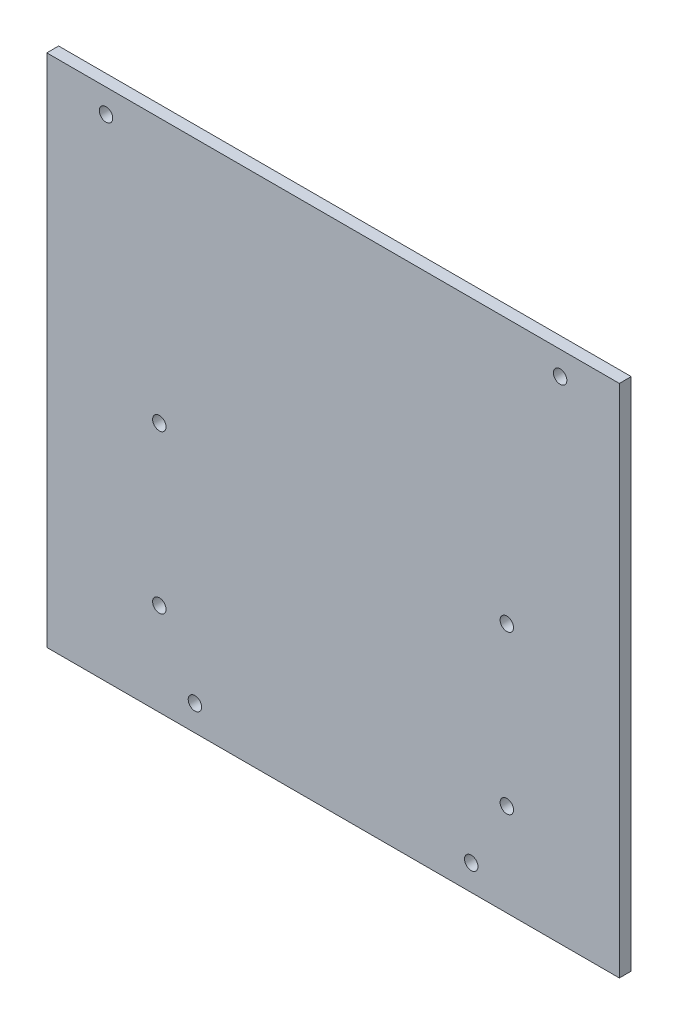
ISO-10303-21;
HEADER;
FILE_DESCRIPTION(('STEP AP214'),'2;1');
FILE_NAME('part.step','',(''),(''),'','','');
FILE_SCHEMA(('AUTOMOTIVE_DESIGN { 1 0 10303 214 1 1 1 1 }'));
ENDSEC;
DATA;
#1=APPLICATION_CONTEXT('core data for automotive mechanical design processes');
#2=APPLICATION_PROTOCOL_DEFINITION('international standard','automotive_design',2000,#1);
#3=PRODUCT_CONTEXT('',#1,'mechanical');
#4=PRODUCT('Part','Part','',(#3));
#5=PRODUCT_RELATED_PRODUCT_CATEGORY('part','',(#4));
#6=PRODUCT_DEFINITION_FORMATION('','',#4);
#7=PRODUCT_DEFINITION_CONTEXT('part definition',#1,'design');
#8=PRODUCT_DEFINITION('design','',#6,#7);
#9=PRODUCT_DEFINITION_SHAPE('','',#8);
#10=(LENGTH_UNIT() NAMED_UNIT(*) SI_UNIT(.MILLI.,.METRE.));
#11=(NAMED_UNIT(*) PLANE_ANGLE_UNIT() SI_UNIT($,.RADIAN.));
#12=(NAMED_UNIT(*) SI_UNIT($,.STERADIAN.) SOLID_ANGLE_UNIT());
#13=UNCERTAINTY_MEASURE_WITH_UNIT(LENGTH_MEASURE(1.E-05),#10,'distance_accuracy_value','');
#14=(GEOMETRIC_REPRESENTATION_CONTEXT(3) GLOBAL_UNCERTAINTY_ASSIGNED_CONTEXT((#13)) GLOBAL_UNIT_ASSIGNED_CONTEXT((#10,
#11,#12)) REPRESENTATION_CONTEXT('',''));
#15=CARTESIAN_POINT('',(0.,0.,0.));
#16=DIRECTION('',(0.,0.,1.));
#17=DIRECTION('',(1.,0.,0.));
#18=AXIS2_PLACEMENT_3D('',#15,#16,#17);
#19=CARTESIAN_POINT('',(-72.5,0.,3.));
#20=DIRECTION('',(1.,0.,0.));
#21=DIRECTION('',(0.,0.,-1.));
#22=AXIS2_PLACEMENT_3D('',#19,#20,#21);
#23=PLANE('',#22);
#24=DIRECTION('',(0.,-1.,0.));
#25=VECTOR('',#24,1.);
#26=CARTESIAN_POINT('',(-72.5,0.,0.));
#27=LINE('',#26,#25);
#28=CARTESIAN_POINT('',(-72.5,130.4,0.));
#29=VERTEX_POINT('',#28);
#30=CARTESIAN_POINT('',(-72.5,0.,0.));
#31=VERTEX_POINT('',#30);
#32=EDGE_CURVE('E103',#29,#31,#27,.T.);
#33=ORIENTED_EDGE('',*,*,#32,.T.);
#34=DIRECTION('',(0.,0.,-1.));
#35=VECTOR('',#34,1.);
#36=CARTESIAN_POINT('',(-72.5,0.,3.));
#37=LINE('',#36,#35);
#38=CARTESIAN_POINT('',(-72.5,0.,3.));
#39=VERTEX_POINT('',#38);
#40=EDGE_CURVE('E11',#39,#31,#37,.T.);
#41=ORIENTED_EDGE('',*,*,#40,.F.);
#42=DIRECTION('',(0.,-1.,0.));
#43=VECTOR('',#42,1.);
#44=CARTESIAN_POINT('',(-72.5,0.,3.));
#45=LINE('',#44,#43);
#46=CARTESIAN_POINT('',(-72.5,130.4,3.));
#47=VERTEX_POINT('',#46);
#48=EDGE_CURVE('E90',#47,#39,#45,.T.);
#49=ORIENTED_EDGE('',*,*,#48,.F.);
#50=DIRECTION('',(0.,0.,-1.));
#51=VECTOR('',#50,1.);
#52=CARTESIAN_POINT('',(-72.5,130.4,3.));
#53=LINE('',#52,#51);
#54=EDGE_CURVE('E99',#47,#29,#53,.T.);
#55=ORIENTED_EDGE('',*,*,#54,.T.);
#56=EDGE_LOOP('',(#33,#41,#49,#55));
#57=FACE_BOUND('',#56,.T.);
#58=ADVANCED_FACE('F37',(#57),#23,.F.);
#59=CARTESIAN_POINT('',(-72.5,0.,3.));
#60=DIRECTION('',(0.,1.,0.));
#61=DIRECTION('',(0.,0.,1.));
#62=AXIS2_PLACEMENT_3D('',#59,#60,#61);
#63=PLANE('',#62);
#64=DIRECTION('',(1.,0.,0.));
#65=VECTOR('',#64,1.);
#66=CARTESIAN_POINT('',(-72.5,0.,0.));
#67=LINE('',#66,#65);
#68=CARTESIAN_POINT('',(72.5,0.,0.));
#69=VERTEX_POINT('',#68);
#70=EDGE_CURVE('E94',#31,#69,#67,.T.);
#71=ORIENTED_EDGE('',*,*,#70,.T.);
#72=DIRECTION('',(0.,0.,-1.));
#73=VECTOR('',#72,1.);
#74=CARTESIAN_POINT('',(72.5,0.,3.));
#75=LINE('',#74,#73);
#76=CARTESIAN_POINT('',(72.5,0.,3.));
#77=VERTEX_POINT('',#76);
#78=EDGE_CURVE('E46',#77,#69,#75,.T.);
#79=ORIENTED_EDGE('',*,*,#78,.F.);
#80=DIRECTION('',(1.,0.,0.));
#81=VECTOR('',#80,1.);
#82=CARTESIAN_POINT('',(-72.5,0.,3.));
#83=LINE('',#82,#81);
#84=EDGE_CURVE('E85',#39,#77,#83,.T.);
#85=ORIENTED_EDGE('',*,*,#84,.F.);
#86=ORIENTED_EDGE('',*,*,#40,.T.);
#87=EDGE_LOOP('',(#71,#79,#85,#86));
#88=FACE_BOUND('',#87,.T.);
#89=ADVANCED_FACE('F93',(#88),#63,.F.);
#90=CARTESIAN_POINT('',(72.5,0.,3.));
#91=DIRECTION('',(-1.,0.,0.));
#92=DIRECTION('',(0.,0.,1.));
#93=AXIS2_PLACEMENT_3D('',#90,#91,#92);
#94=PLANE('',#93);
#95=DIRECTION('',(0.,1.,0.));
#96=VECTOR('',#95,1.);
#97=CARTESIAN_POINT('',(72.5,0.,0.));
#98=LINE('',#97,#96);
#99=CARTESIAN_POINT('',(72.5,130.4,0.));
#100=VERTEX_POINT('',#99);
#101=EDGE_CURVE('E72',#69,#100,#98,.T.);
#102=ORIENTED_EDGE('',*,*,#101,.T.);
#103=DIRECTION('',(0.,0.,-1.));
#104=VECTOR('',#103,1.);
#105=CARTESIAN_POINT('',(72.5,130.4,3.));
#106=LINE('',#105,#104);
#107=CARTESIAN_POINT('',(72.5,130.4,3.));
#108=VERTEX_POINT('',#107);
#109=EDGE_CURVE('E95',#108,#100,#106,.T.);
#110=ORIENTED_EDGE('',*,*,#109,.F.);
#111=DIRECTION('',(0.,1.,0.));
#112=VECTOR('',#111,1.);
#113=CARTESIAN_POINT('',(72.5,0.,3.));
#114=LINE('',#113,#112);
#115=EDGE_CURVE('E88',#77,#108,#114,.T.);
#116=ORIENTED_EDGE('',*,*,#115,.F.);
#117=ORIENTED_EDGE('',*,*,#78,.T.);
#118=EDGE_LOOP('',(#102,#110,#116,#117));
#119=FACE_BOUND('',#118,.T.);
#120=ADVANCED_FACE('F97',(#119),#94,.F.);
#121=CARTESIAN_POINT('',(-72.5,130.4,3.));
#122=DIRECTION('',(0.,-1.,0.));
#123=DIRECTION('',(0.,0.,-1.));
#124=AXIS2_PLACEMENT_3D('',#121,#122,#123);
#125=PLANE('',#124);
#126=DIRECTION('',(-1.,0.,0.));
#127=VECTOR('',#126,1.);
#128=CARTESIAN_POINT('',(-72.5,130.4,0.));
#129=LINE('',#128,#127);
#130=EDGE_CURVE('E78',#100,#29,#129,.T.);
#131=ORIENTED_EDGE('',*,*,#130,.T.);
#132=ORIENTED_EDGE('',*,*,#54,.F.);
#133=DIRECTION('',(-1.,0.,0.));
#134=VECTOR('',#133,1.);
#135=CARTESIAN_POINT('',(-72.5,130.4,3.));
#136=LINE('',#135,#134);
#137=EDGE_CURVE('E55',#108,#47,#136,.T.);
#138=ORIENTED_EDGE('',*,*,#137,.F.);
#139=ORIENTED_EDGE('',*,*,#109,.T.);
#140=EDGE_LOOP('',(#131,#132,#138,#139));
#141=FACE_BOUND('',#140,.T.);
#142=ADVANCED_FACE('F159',(#141),#125,.F.);
#143=CARTESIAN_POINT('',(0.,0.,3.));
#144=DIRECTION('',(0.,0.,-1.));
#145=DIRECTION('',(-1.,0.,0.));
#146=AXIS2_PLACEMENT_3D('',#143,#144,#145);
#147=PLANE('',#146);
#148=CARTESIAN_POINT('',(-57.4999999999998,124.4,3.));
#149=DIRECTION('',(0.,0.,1.));
#150=DIRECTION('',(1.,0.,0.));
#151=AXIS2_PLACEMENT_3D('',#148,#149,#150);
#152=CIRCLE('',#151,1.7);
#153=CARTESIAN_POINT('',(-55.7999999999998,124.4,3.));
#154=VERTEX_POINT('',#153);
#155=EDGE_CURVE('E115',#154,#154,#152,.T.);
#156=ORIENTED_EDGE('',*,*,#155,.F.);
#157=EDGE_LOOP('',(#156));
#158=FACE_BOUND('',#157,.T.);
#159=CARTESIAN_POINT('',(43.9999999999985,63.4388042254799,3.));
#160=DIRECTION('',(0.,0.,1.));
#161=DIRECTION('',(1.,0.,0.));
#162=AXIS2_PLACEMENT_3D('',#159,#160,#161);
#163=CIRCLE('',#162,1.7);
#164=CARTESIAN_POINT('',(45.6999999999985,63.4388042254799,3.));
#165=VERTEX_POINT('',#164);
#166=EDGE_CURVE('E312',#165,#165,#163,.T.);
#167=ORIENTED_EDGE('',*,*,#166,.F.);
#168=EDGE_LOOP('',(#167));
#169=FACE_BOUND('',#168,.T.);
#170=CARTESIAN_POINT('',(-34.9875,6.5,3.));
#171=DIRECTION('',(0.,0.,1.));
#172=DIRECTION('',(1.,0.,0.));
#173=AXIS2_PLACEMENT_3D('',#170,#171,#172);
#174=CIRCLE('',#173,1.7);
#175=CARTESIAN_POINT('',(-33.2875,6.5,3.));
#176=VERTEX_POINT('',#175);
#177=EDGE_CURVE('E315',#176,#176,#174,.T.);
#178=ORIENTED_EDGE('',*,*,#177,.F.);
#179=EDGE_LOOP('',(#178));
#180=FACE_BOUND('',#179,.T.);
#181=CARTESIAN_POINT('',(34.9875,6.5,3.));
#182=DIRECTION('',(0.,0.,1.));
#183=DIRECTION('',(1.,0.,0.));
#184=AXIS2_PLACEMENT_3D('',#181,#182,#183);
#185=CIRCLE('',#184,1.7);
#186=CARTESIAN_POINT('',(36.6875,6.5,3.));
#187=VERTEX_POINT('',#186);
#188=EDGE_CURVE('E321',#187,#187,#185,.T.);
#189=ORIENTED_EDGE('',*,*,#188,.F.);
#190=EDGE_LOOP('',(#189));
#191=FACE_BOUND('',#190,.T.);
#192=CARTESIAN_POINT('',(43.9999999999993,23.4388042254799,3.));
#193=DIRECTION('',(0.,0.,1.));
#194=DIRECTION('',(1.,0.,0.));
#195=AXIS2_PLACEMENT_3D('',#192,#193,#194);
#196=CIRCLE('',#195,1.69999999999999);
#197=CARTESIAN_POINT('',(45.6999999999993,23.4388042254799,3.));
#198=VERTEX_POINT('',#197);
#199=EDGE_CURVE('E314',#198,#198,#196,.T.);
#200=ORIENTED_EDGE('',*,*,#199,.F.);
#201=EDGE_LOOP('',(#200));
#202=FACE_BOUND('',#201,.T.);
#203=CARTESIAN_POINT('',(-44.0000000000007,23.4388042254779,3.));
#204=DIRECTION('',(0.,0.,1.));
#205=DIRECTION('',(1.,0.,0.));
#206=AXIS2_PLACEMENT_3D('',#203,#204,#205);
#207=CIRCLE('',#206,1.7);
#208=CARTESIAN_POINT('',(-42.3000000000007,23.4388042254779,3.));
#209=VERTEX_POINT('',#208);
#210=EDGE_CURVE('E318',#209,#209,#207,.T.);
#211=ORIENTED_EDGE('',*,*,#210,.F.);
#212=EDGE_LOOP('',(#211));
#213=FACE_BOUND('',#212,.T.);
#214=CARTESIAN_POINT('',(-44.000000000001,63.438804225477,3.));
#215=DIRECTION('',(0.,0.,1.));
#216=DIRECTION('',(1.,0.,0.));
#217=AXIS2_PLACEMENT_3D('',#214,#215,#216);
#218=CIRCLE('',#217,1.7);
#219=CARTESIAN_POINT('',(-42.300000000001,63.438804225477,3.));
#220=VERTEX_POINT('',#219);
#221=EDGE_CURVE('E329',#220,#220,#218,.T.);
#222=ORIENTED_EDGE('',*,*,#221,.F.);
#223=EDGE_LOOP('',(#222));
#224=FACE_BOUND('',#223,.T.);
#225=CARTESIAN_POINT('',(57.5,124.4,3.));
#226=DIRECTION('',(0.,0.,1.));
#227=DIRECTION('',(1.,0.,0.));
#228=AXIS2_PLACEMENT_3D('',#225,#226,#227);
#229=CIRCLE('',#228,1.7);
#230=CARTESIAN_POINT('',(59.2,124.4,3.));
#231=VERTEX_POINT('',#230);
#232=EDGE_CURVE('E326',#231,#231,#229,.T.);
#233=ORIENTED_EDGE('',*,*,#232,.F.);
#234=EDGE_LOOP('',(#233));
#235=FACE_BOUND('',#234,.T.);
#236=ORIENTED_EDGE('',*,*,#48,.T.);
#237=ORIENTED_EDGE('',*,*,#84,.T.);
#238=ORIENTED_EDGE('',*,*,#115,.T.);
#239=ORIENTED_EDGE('',*,*,#137,.T.);
#240=EDGE_LOOP('',(#236,#237,#238,#239));
#241=FACE_BOUND('',#240,.T.);
#242=ADVANCED_FACE('F86',(#158,#169,#180,#191,#202,#213,#224,#235,#241),#147,.F.);
#243=CARTESIAN_POINT('',(0.,0.,0.));
#244=DIRECTION('',(0.,0.,-1.));
#245=DIRECTION('',(-1.,0.,0.));
#246=AXIS2_PLACEMENT_3D('',#243,#244,#245);
#247=PLANE('',#246);
#248=CARTESIAN_POINT('',(-57.4999999999998,124.4,0.));
#249=DIRECTION('',(0.,0.,-1.));
#250=DIRECTION('',(-1.,0.,0.));
#251=AXIS2_PLACEMENT_3D('',#248,#249,#250);
#252=CIRCLE('',#251,1.7);
#253=CARTESIAN_POINT('',(-59.1999999999998,124.4,0.));
#254=VERTEX_POINT('',#253);
#255=EDGE_CURVE('E40',#254,#254,#252,.T.);
#256=ORIENTED_EDGE('',*,*,#255,.F.);
#257=EDGE_LOOP('',(#256));
#258=FACE_BOUND('',#257,.T.);
#259=CARTESIAN_POINT('',(43.9999999999985,63.4388042254799,0.));
#260=DIRECTION('',(0.,0.,-1.));
#261=DIRECTION('',(-1.,0.,0.));
#262=AXIS2_PLACEMENT_3D('',#259,#260,#261);
#263=CIRCLE('',#262,1.7);
#264=CARTESIAN_POINT('',(42.2999999999985,63.4388042254799,0.));
#265=VERTEX_POINT('',#264);
#266=EDGE_CURVE('E129',#265,#265,#263,.T.);
#267=ORIENTED_EDGE('',*,*,#266,.F.);
#268=EDGE_LOOP('',(#267));
#269=FACE_BOUND('',#268,.T.);
#270=CARTESIAN_POINT('',(-34.9875,6.5,0.));
#271=DIRECTION('',(0.,0.,-1.));
#272=DIRECTION('',(-1.,0.,0.));
#273=AXIS2_PLACEMENT_3D('',#270,#271,#272);
#274=CIRCLE('',#273,1.7);
#275=CARTESIAN_POINT('',(-36.6875,6.5,0.));
#276=VERTEX_POINT('',#275);
#277=EDGE_CURVE('E127',#276,#276,#274,.T.);
#278=ORIENTED_EDGE('',*,*,#277,.F.);
#279=EDGE_LOOP('',(#278));
#280=FACE_BOUND('',#279,.T.);
#281=CARTESIAN_POINT('',(34.9875,6.5,0.));
#282=DIRECTION('',(0.,0.,-1.));
#283=DIRECTION('',(-1.,0.,0.));
#284=AXIS2_PLACEMENT_3D('',#281,#282,#283);
#285=CIRCLE('',#284,1.7);
#286=CARTESIAN_POINT('',(33.2875,6.5,0.));
#287=VERTEX_POINT('',#286);
#288=EDGE_CURVE('E124',#287,#287,#285,.T.);
#289=ORIENTED_EDGE('',*,*,#288,.F.);
#290=EDGE_LOOP('',(#289));
#291=FACE_BOUND('',#290,.T.);
#292=CARTESIAN_POINT('',(43.9999999999993,23.4388042254799,0.));
#293=DIRECTION('',(0.,0.,-1.));
#294=DIRECTION('',(-1.,0.,0.));
#295=AXIS2_PLACEMENT_3D('',#292,#293,#294);
#296=CIRCLE('',#295,1.69999999999999);
#297=CARTESIAN_POINT('',(42.2999999999993,23.4388042254799,0.));
#298=VERTEX_POINT('',#297);
#299=EDGE_CURVE('E121',#298,#298,#296,.T.);
#300=ORIENTED_EDGE('',*,*,#299,.F.);
#301=EDGE_LOOP('',(#300));
#302=FACE_BOUND('',#301,.T.);
#303=CARTESIAN_POINT('',(-44.0000000000007,23.4388042254779,0.));
#304=DIRECTION('',(0.,0.,-1.));
#305=DIRECTION('',(-1.,0.,0.));
#306=AXIS2_PLACEMENT_3D('',#303,#304,#305);
#307=CIRCLE('',#306,1.7);
#308=CARTESIAN_POINT('',(-45.7000000000007,23.4388042254779,0.));
#309=VERTEX_POINT('',#308);
#310=EDGE_CURVE('E118',#309,#309,#307,.T.);
#311=ORIENTED_EDGE('',*,*,#310,.F.);
#312=EDGE_LOOP('',(#311));
#313=FACE_BOUND('',#312,.T.);
#314=CARTESIAN_POINT('',(-44.000000000001,63.438804225477,0.));
#315=DIRECTION('',(0.,0.,-1.));
#316=DIRECTION('',(-1.,0.,0.));
#317=AXIS2_PLACEMENT_3D('',#314,#315,#316);
#318=CIRCLE('',#317,1.7);
#319=CARTESIAN_POINT('',(-45.700000000001,63.438804225477,0.));
#320=VERTEX_POINT('',#319);
#321=EDGE_CURVE('E114',#320,#320,#318,.T.);
#322=ORIENTED_EDGE('',*,*,#321,.F.);
#323=EDGE_LOOP('',(#322));
#324=FACE_BOUND('',#323,.T.);
#325=CARTESIAN_POINT('',(57.5,124.4,0.));
#326=DIRECTION('',(0.,0.,-1.));
#327=DIRECTION('',(-1.,0.,0.));
#328=AXIS2_PLACEMENT_3D('',#325,#326,#327);
#329=CIRCLE('',#328,1.7);
#330=CARTESIAN_POINT('',(55.8,124.4,0.));
#331=VERTEX_POINT('',#330);
#332=EDGE_CURVE('E111',#331,#331,#329,.T.);
#333=ORIENTED_EDGE('',*,*,#332,.F.);
#334=EDGE_LOOP('',(#333));
#335=FACE_BOUND('',#334,.T.);
#336=ORIENTED_EDGE('',*,*,#32,.F.);
#337=ORIENTED_EDGE('',*,*,#130,.F.);
#338=ORIENTED_EDGE('',*,*,#101,.F.);
#339=ORIENTED_EDGE('',*,*,#70,.F.);
#340=EDGE_LOOP('',(#336,#337,#338,#339));
#341=FACE_BOUND('',#340,.T.);
#342=ADVANCED_FACE('F139',(#258,#269,#280,#291,#302,#313,#324,#335,#341),#247,.T.);
#343=CARTESIAN_POINT('',(57.5,124.4,-7.));
#344=DIRECTION('',(0.,0.,1.));
#345=DIRECTION('',(1.,0.,0.));
#346=AXIS2_PLACEMENT_3D('',#343,#344,#345);
#347=CYLINDRICAL_SURFACE('',#346,1.7);
#348=ORIENTED_EDGE('',*,*,#332,.T.);
#349=EDGE_LOOP('',(#348));
#350=FACE_BOUND('',#349,.T.);
#351=ORIENTED_EDGE('',*,*,#232,.T.);
#352=EDGE_LOOP('',(#351));
#353=FACE_BOUND('',#352,.T.);
#354=ADVANCED_FACE('F142',(#350,#353),#347,.F.);
#355=CARTESIAN_POINT('',(-44.000000000001,63.438804225477,-7.));
#356=DIRECTION('',(0.,0.,1.));
#357=DIRECTION('',(1.,0.,0.));
#358=AXIS2_PLACEMENT_3D('',#355,#356,#357);
#359=CYLINDRICAL_SURFACE('',#358,1.7);
#360=ORIENTED_EDGE('',*,*,#321,.T.);
#361=EDGE_LOOP('',(#360));
#362=FACE_BOUND('',#361,.T.);
#363=ORIENTED_EDGE('',*,*,#221,.T.);
#364=EDGE_LOOP('',(#363));
#365=FACE_BOUND('',#364,.T.);
#366=ADVANCED_FACE('F208',(#362,#365),#359,.F.);
#367=CARTESIAN_POINT('',(-44.0000000000007,23.4388042254779,-7.));
#368=DIRECTION('',(0.,0.,1.));
#369=DIRECTION('',(1.,0.,0.));
#370=AXIS2_PLACEMENT_3D('',#367,#368,#369);
#371=CYLINDRICAL_SURFACE('',#370,1.7);
#372=ORIENTED_EDGE('',*,*,#310,.T.);
#373=EDGE_LOOP('',(#372));
#374=FACE_BOUND('',#373,.T.);
#375=ORIENTED_EDGE('',*,*,#210,.T.);
#376=EDGE_LOOP('',(#375));
#377=FACE_BOUND('',#376,.T.);
#378=ADVANCED_FACE('F219',(#374,#377),#371,.F.);
#379=CARTESIAN_POINT('',(43.9999999999993,23.4388042254799,-7.));
#380=DIRECTION('',(0.,0.,1.));
#381=DIRECTION('',(1.,0.,0.));
#382=AXIS2_PLACEMENT_3D('',#379,#380,#381);
#383=CYLINDRICAL_SURFACE('',#382,1.69999999999999);
#384=ORIENTED_EDGE('',*,*,#299,.T.);
#385=EDGE_LOOP('',(#384));
#386=FACE_BOUND('',#385,.T.);
#387=ORIENTED_EDGE('',*,*,#199,.T.);
#388=EDGE_LOOP('',(#387));
#389=FACE_BOUND('',#388,.T.);
#390=ADVANCED_FACE('F230',(#386,#389),#383,.F.);
#391=CARTESIAN_POINT('',(34.9875,6.5,-7.));
#392=DIRECTION('',(0.,0.,1.));
#393=DIRECTION('',(1.,0.,0.));
#394=AXIS2_PLACEMENT_3D('',#391,#392,#393);
#395=CYLINDRICAL_SURFACE('',#394,1.7);
#396=ORIENTED_EDGE('',*,*,#288,.T.);
#397=EDGE_LOOP('',(#396));
#398=FACE_BOUND('',#397,.T.);
#399=ORIENTED_EDGE('',*,*,#188,.T.);
#400=EDGE_LOOP('',(#399));
#401=FACE_BOUND('',#400,.T.);
#402=ADVANCED_FACE('F241',(#398,#401),#395,.F.);
#403=CARTESIAN_POINT('',(-34.9875,6.5,-7.));
#404=DIRECTION('',(0.,0.,1.));
#405=DIRECTION('',(1.,0.,0.));
#406=AXIS2_PLACEMENT_3D('',#403,#404,#405);
#407=CYLINDRICAL_SURFACE('',#406,1.7);
#408=ORIENTED_EDGE('',*,*,#277,.T.);
#409=EDGE_LOOP('',(#408));
#410=FACE_BOUND('',#409,.T.);
#411=ORIENTED_EDGE('',*,*,#177,.T.);
#412=EDGE_LOOP('',(#411));
#413=FACE_BOUND('',#412,.T.);
#414=ADVANCED_FACE('F252',(#410,#413),#407,.F.);
#415=CARTESIAN_POINT('',(43.9999999999985,63.4388042254799,-7.));
#416=DIRECTION('',(0.,0.,1.));
#417=DIRECTION('',(1.,0.,0.));
#418=AXIS2_PLACEMENT_3D('',#415,#416,#417);
#419=CYLINDRICAL_SURFACE('',#418,1.7);
#420=ORIENTED_EDGE('',*,*,#266,.T.);
#421=EDGE_LOOP('',(#420));
#422=FACE_BOUND('',#421,.T.);
#423=ORIENTED_EDGE('',*,*,#166,.T.);
#424=EDGE_LOOP('',(#423));
#425=FACE_BOUND('',#424,.T.);
#426=ADVANCED_FACE('F263',(#422,#425),#419,.F.);
#427=CARTESIAN_POINT('',(-57.4999999999998,124.4,-7.));
#428=DIRECTION('',(0.,0.,1.));
#429=DIRECTION('',(1.,0.,0.));
#430=AXIS2_PLACEMENT_3D('',#427,#428,#429);
#431=CYLINDRICAL_SURFACE('',#430,1.7);
#432=ORIENTED_EDGE('',*,*,#255,.T.);
#433=EDGE_LOOP('',(#432));
#434=FACE_BOUND('',#433,.T.);
#435=ORIENTED_EDGE('',*,*,#155,.T.);
#436=EDGE_LOOP('',(#435));
#437=FACE_BOUND('',#436,.T.);
#438=ADVANCED_FACE('F136',(#434,#437),#431,.F.);
#439=CLOSED_SHELL('',(#58,#89,#120,#142,#242,#342,#354,#366,#378,#390,#402,#414,#426,#438));
#440=MANIFOLD_SOLID_BREP('B2',#439);
#441=ADVANCED_BREP_SHAPE_REPRESENTATION('',(#18,#440),#14);
#442=SHAPE_DEFINITION_REPRESENTATION(#9,#441);
ENDSEC;
END-ISO-10303-21;
